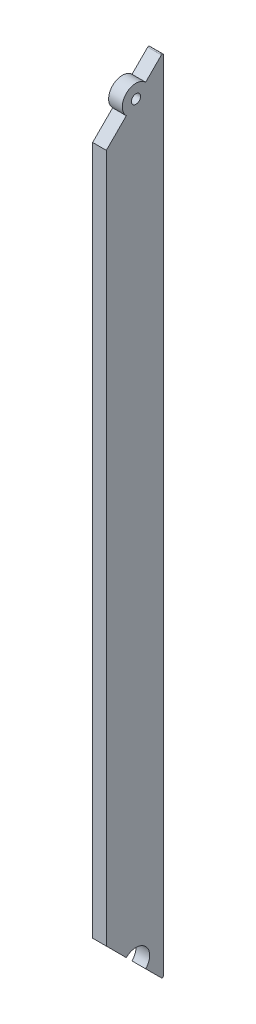
ISO-10303-21;
HEADER;
FILE_DESCRIPTION(('STEP AP214'),'2;1');
FILE_NAME('part.step','',(''),(''),'','','');
FILE_SCHEMA(('AUTOMOTIVE_DESIGN { 1 0 10303 214 1 1 1 1 }'));
ENDSEC;
DATA;
#1=APPLICATION_CONTEXT('core data for automotive mechanical design processes');
#2=APPLICATION_PROTOCOL_DEFINITION('international standard','automotive_design',2000,#1);
#3=PRODUCT_CONTEXT('',#1,'mechanical');
#4=PRODUCT('Part','Part','',(#3));
#5=PRODUCT_RELATED_PRODUCT_CATEGORY('part','',(#4));
#6=PRODUCT_DEFINITION_FORMATION('','',#4);
#7=PRODUCT_DEFINITION_CONTEXT('part definition',#1,'design');
#8=PRODUCT_DEFINITION('design','',#6,#7);
#9=PRODUCT_DEFINITION_SHAPE('','',#8);
#10=(LENGTH_UNIT() NAMED_UNIT(*) SI_UNIT(.MILLI.,.METRE.));
#11=(NAMED_UNIT(*) PLANE_ANGLE_UNIT() SI_UNIT($,.RADIAN.));
#12=(NAMED_UNIT(*) SI_UNIT($,.STERADIAN.) SOLID_ANGLE_UNIT());
#13=UNCERTAINTY_MEASURE_WITH_UNIT(LENGTH_MEASURE(1.E-05),#10,'distance_accuracy_value','');
#14=(GEOMETRIC_REPRESENTATION_CONTEXT(3) GLOBAL_UNCERTAINTY_ASSIGNED_CONTEXT((#13)) GLOBAL_UNIT_ASSIGNED_CONTEXT((#10,
#11,#12)) REPRESENTATION_CONTEXT('',''));
#15=CARTESIAN_POINT('',(0.,0.,0.));
#16=DIRECTION('',(0.,0.,1.));
#17=DIRECTION('',(1.,0.,0.));
#18=AXIS2_PLACEMENT_3D('',#15,#16,#17);
#19=CARTESIAN_POINT('',(6.,24.9999999999999,25.));
#20=DIRECTION('',(0.,0.707106781186549,-0.707106781186546));
#21=DIRECTION('',(0.,0.707106781186546,0.707106781186549));
#22=AXIS2_PLACEMENT_3D('',#19,#20,#21);
#23=PLANE('',#22);
#24=DIRECTION('',(0.,-0.707106781186546,-0.707106781186549));
#25=VECTOR('',#24,1.);
#26=CARTESIAN_POINT('',(0.,24.9999999999999,25.));
#27=LINE('',#26,#25);
#28=CARTESIAN_POINT('',(0.,24.9999999999999,25.));
#29=VERTEX_POINT('',#28);
#30=CARTESIAN_POINT('',(0.,16.2426406871193,16.2426406871193));
#31=VERTEX_POINT('',#30);
#32=EDGE_CURVE('E131',#29,#31,#27,.T.);
#33=ORIENTED_EDGE('',*,*,#32,.T.);
#34=DIRECTION('',(1.,0.,0.));
#35=VECTOR('',#34,1.);
#36=CARTESIAN_POINT('',(0.,16.2426406871193,16.2426406871193));
#37=LINE('',#36,#35);
#38=CARTESIAN_POINT('',(6.,16.2426406871193,16.2426406871193));
#39=VERTEX_POINT('',#38);
#40=EDGE_CURVE('E53',#31,#39,#37,.T.);
#41=ORIENTED_EDGE('',*,*,#40,.T.);
#42=DIRECTION('',(0.,-0.707106781186546,-0.707106781186549));
#43=VECTOR('',#42,1.);
#44=CARTESIAN_POINT('',(6.,24.9999999999999,25.));
#45=LINE('',#44,#43);
#46=CARTESIAN_POINT('',(6.,24.9999999999999,25.));
#47=VERTEX_POINT('',#46);
#48=EDGE_CURVE('E193',#47,#39,#45,.T.);
#49=ORIENTED_EDGE('',*,*,#48,.F.);
#50=DIRECTION('',(-1.,0.,0.));
#51=VECTOR('',#50,1.);
#52=CARTESIAN_POINT('',(6.,24.9999999999999,25.));
#53=LINE('',#52,#51);
#54=EDGE_CURVE('E152',#47,#29,#53,.T.);
#55=ORIENTED_EDGE('',*,*,#54,.T.);
#56=EDGE_LOOP('',(#33,#41,#49,#55));
#57=FACE_BOUND('',#56,.T.);
#58=ADVANCED_FACE('F39',(#57),#23,.F.);
#59=CARTESIAN_POINT('',(6.,327.,25.));
#60=DIRECTION('',(0.,-0.707106781186544,-0.707106781186551));
#61=DIRECTION('',(0.,0.707106781186551,-0.707106781186544));
#62=AXIS2_PLACEMENT_3D('',#59,#60,#61);
#63=PLANE('',#62);
#64=DIRECTION('',(0.,-0.707106781186552,0.707106781186544));
#65=VECTOR('',#64,1.);
#66=CARTESIAN_POINT('',(0.,327.,25.));
#67=LINE('',#66,#65);
#68=CARTESIAN_POINT('',(0.,351.146446609407,0.853553390593276));
#69=VERTEX_POINT('',#68);
#70=CARTESIAN_POINT('',(0.,344.242640687119,7.75735931288067));
#71=VERTEX_POINT('',#70);
#72=EDGE_CURVE('E150',#69,#71,#67,.T.);
#73=ORIENTED_EDGE('',*,*,#72,.T.);
#74=DIRECTION('',(1.,0.,0.));
#75=VECTOR('',#74,1.);
#76=CARTESIAN_POINT('',(-16.9705627484772,344.242640687119,7.75735931288067));
#77=LINE('',#76,#75);
#78=CARTESIAN_POINT('',(6.,344.242640687119,7.75735931288067));
#79=VERTEX_POINT('',#78);
#80=EDGE_CURVE('E133',#71,#79,#77,.T.);
#81=ORIENTED_EDGE('',*,*,#80,.T.);
#82=DIRECTION('',(0.,-0.707106781186552,0.707106781186544));
#83=VECTOR('',#82,1.);
#84=CARTESIAN_POINT('',(6.,327.,25.));
#85=LINE('',#84,#83);
#86=CARTESIAN_POINT('',(6.,351.146446609407,0.853553390593276));
#87=VERTEX_POINT('',#86);
#88=EDGE_CURVE('E179',#87,#79,#85,.T.);
#89=ORIENTED_EDGE('',*,*,#88,.F.);
#90=DIRECTION('',(-1.,0.,0.));
#91=VECTOR('',#90,1.);
#92=CARTESIAN_POINT('',(6.,351.146446609407,0.853553390593283));
#93=LINE('',#92,#91);
#94=EDGE_CURVE('E50',#87,#69,#93,.T.);
#95=ORIENTED_EDGE('',*,*,#94,.T.);
#96=EDGE_LOOP('',(#73,#81,#89,#95));
#97=FACE_BOUND('',#96,.T.);
#98=ADVANCED_FACE('F173',(#97),#63,.F.);
#99=CARTESIAN_POINT('',(6.,7.7573593128807,7.75735931288073));
#100=VERTEX_POINT('',#99);
#101=CARTESIAN_POINT('',(6.,0.853553390593287,0.85355339059329));
#102=VERTEX_POINT('',#101);
#103=EDGE_CURVE('E130',#100,#102,#45,.T.);
#104=ORIENTED_EDGE('',*,*,#103,.F.);
#105=DIRECTION('',(1.,0.,0.));
#106=VECTOR('',#105,1.);
#107=CARTESIAN_POINT('',(0.,7.7573593128807,7.75735931288073));
#108=LINE('',#107,#106);
#109=CARTESIAN_POINT('',(0.,7.7573593128807,7.75735931288073));
#110=VERTEX_POINT('',#109);
#111=EDGE_CURVE('E112',#100,#110,#108,.F.);
#112=ORIENTED_EDGE('',*,*,#111,.T.);
#113=CARTESIAN_POINT('',(0.,0.853553390593287,0.85355339059329));
#114=VERTEX_POINT('',#113);
#115=EDGE_CURVE('E124',#110,#114,#27,.T.);
#116=ORIENTED_EDGE('',*,*,#115,.T.);
#117=DIRECTION('',(-1.,0.,0.));
#118=VECTOR('',#117,1.);
#119=CARTESIAN_POINT('',(6.,0.853553390593287,0.85355339059329));
#120=LINE('',#119,#118);
#121=EDGE_CURVE('E162',#114,#102,#120,.F.);
#122=ORIENTED_EDGE('',*,*,#121,.T.);
#123=EDGE_LOOP('',(#104,#112,#116,#122));
#124=FACE_BOUND('',#123,.T.);
#125=ADVANCED_FACE('F123',(#124),#23,.F.);
#126=CARTESIAN_POINT('',(6.,352.,0.));
#127=DIRECTION('',(0.,0.,1.));
#128=DIRECTION('',(1.,0.,0.));
#129=AXIS2_PLACEMENT_3D('',#126,#127,#128);
#130=PLANE('',#129);
#131=DIRECTION('',(0.,1.,0.));
#132=VECTOR('',#131,1.);
#133=CARTESIAN_POINT('',(6.,352.,0.));
#134=LINE('',#133,#132);
#135=CARTESIAN_POINT('',(6.,1.20710678118657,0.));
#136=VERTEX_POINT('',#135);
#137=CARTESIAN_POINT('',(6.,350.792893218813,0.));
#138=VERTEX_POINT('',#137);
#139=EDGE_CURVE('E196',#136,#138,#134,.T.);
#140=ORIENTED_EDGE('',*,*,#139,.F.);
#141=DIRECTION('',(-1.,0.,0.));
#142=VECTOR('',#141,1.);
#143=CARTESIAN_POINT('',(6.,1.20710678118657,0.));
#144=LINE('',#143,#142);
#145=CARTESIAN_POINT('',(0.,1.20710678118657,0.));
#146=VERTEX_POINT('',#145);
#147=EDGE_CURVE('E159',#136,#146,#144,.T.);
#148=ORIENTED_EDGE('',*,*,#147,.T.);
#149=DIRECTION('',(0.,1.,0.));
#150=VECTOR('',#149,1.);
#151=CARTESIAN_POINT('',(0.,352.,0.));
#152=LINE('',#151,#150);
#153=CARTESIAN_POINT('',(0.,350.792893218813,0.));
#154=VERTEX_POINT('',#153);
#155=EDGE_CURVE('E136',#146,#154,#152,.T.);
#156=ORIENTED_EDGE('',*,*,#155,.T.);
#157=DIRECTION('',(-1.,0.,0.));
#158=VECTOR('',#157,1.);
#159=CARTESIAN_POINT('',(6.,350.792893218813,0.));
#160=LINE('',#159,#158);
#161=EDGE_CURVE('E160',#154,#138,#160,.F.);
#162=ORIENTED_EDGE('',*,*,#161,.T.);
#163=EDGE_LOOP('',(#140,#148,#156,#162));
#164=FACE_BOUND('',#163,.T.);
#165=ADVANCED_FACE('F245',(#164),#130,.F.);
#166=CARTESIAN_POINT('',(6.,335.757359312881,16.2426406871192));
#167=VERTEX_POINT('',#166);
#168=CARTESIAN_POINT('',(6.,327.,25.));
#169=VERTEX_POINT('',#168);
#170=EDGE_CURVE('E64',#167,#169,#85,.T.);
#171=ORIENTED_EDGE('',*,*,#170,.F.);
#172=DIRECTION('',(1.,0.,0.));
#173=VECTOR('',#172,1.);
#174=CARTESIAN_POINT('',(-16.9705627484772,335.757359312881,16.2426406871192));
#175=LINE('',#174,#173);
#176=CARTESIAN_POINT('',(0.,335.757359312881,16.2426406871192));
#177=VERTEX_POINT('',#176);
#178=EDGE_CURVE('E140',#167,#177,#175,.F.);
#179=ORIENTED_EDGE('',*,*,#178,.T.);
#180=CARTESIAN_POINT('',(0.,327.,25.));
#181=VERTEX_POINT('',#180);
#182=EDGE_CURVE('E147',#177,#181,#67,.T.);
#183=ORIENTED_EDGE('',*,*,#182,.T.);
#184=DIRECTION('',(-1.,0.,0.));
#185=VECTOR('',#184,1.);
#186=CARTESIAN_POINT('',(6.,327.,25.));
#187=LINE('',#186,#185);
#188=EDGE_CURVE('E151',#169,#181,#187,.T.);
#189=ORIENTED_EDGE('',*,*,#188,.F.);
#190=EDGE_LOOP('',(#171,#179,#183,#189));
#191=FACE_BOUND('',#190,.T.);
#192=ADVANCED_FACE('F202',(#191),#63,.F.);
#193=CARTESIAN_POINT('',(6.,24.9999999999999,25.));
#194=DIRECTION('',(0.,0.,-1.));
#195=DIRECTION('',(0.,1.,0.));
#196=AXIS2_PLACEMENT_3D('',#193,#194,#195);
#197=PLANE('',#196);
#198=DIRECTION('',(0.,-1.,0.));
#199=VECTOR('',#198,1.);
#200=CARTESIAN_POINT('',(0.,24.9999999999999,25.));
#201=LINE('',#200,#199);
#202=EDGE_CURVE('E146',#181,#29,#201,.T.);
#203=ORIENTED_EDGE('',*,*,#202,.T.);
#204=ORIENTED_EDGE('',*,*,#54,.F.);
#205=DIRECTION('',(0.,-1.,0.));
#206=VECTOR('',#205,1.);
#207=CARTESIAN_POINT('',(6.,24.9999999999999,25.));
#208=LINE('',#207,#206);
#209=EDGE_CURVE('E144',#169,#47,#208,.T.);
#210=ORIENTED_EDGE('',*,*,#209,.F.);
#211=ORIENTED_EDGE('',*,*,#188,.T.);
#212=EDGE_LOOP('',(#203,#204,#210,#211));
#213=FACE_BOUND('',#212,.T.);
#214=ADVANCED_FACE('F204',(#213),#197,.F.);
#215=CARTESIAN_POINT('',(6.,0.,0.));
#216=DIRECTION('',(1.,0.,0.));
#217=DIRECTION('',(0.,0.,-1.));
#218=AXIS2_PLACEMENT_3D('',#215,#216,#217);
#219=PLANE('',#218);
#220=CARTESIAN_POINT('',(6.,340.,11.9999999999998));
#221=DIRECTION('',(1.,0.,0.));
#222=DIRECTION('',(0.,0.,-1.));
#223=AXIS2_PLACEMENT_3D('',#220,#221,#222);
#224=CIRCLE('',#223,2.);
#225=CARTESIAN_POINT('',(6.,340.,9.99999999999978));
#226=VERTEX_POINT('',#225);
#227=EDGE_CURVE('E206',#226,#226,#224,.T.);
#228=ORIENTED_EDGE('',*,*,#227,.F.);
#229=EDGE_LOOP('',(#228));
#230=FACE_BOUND('',#229,.T.);
#231=CARTESIAN_POINT('',(6.,12.,12.));
#232=DIRECTION('',(1.,0.,0.));
#233=DIRECTION('',(0.,0.,-1.));
#234=AXIS2_PLACEMENT_3D('',#231,#232,#233);
#235=CIRCLE('',#234,6.);
#236=EDGE_CURVE('E209',#100,#39,#235,.T.);
#237=ORIENTED_EDGE('',*,*,#236,.F.);
#238=ORIENTED_EDGE('',*,*,#103,.T.);
#239=CARTESIAN_POINT('',(6.,1.20710678118657,0.5));
#240=DIRECTION('',(1.,0.,0.));
#241=DIRECTION('',(0.,0.,-1.));
#242=AXIS2_PLACEMENT_3D('',#239,#240,#241);
#243=CIRCLE('',#242,0.5);
#244=EDGE_CURVE('E166',#102,#136,#243,.T.);
#245=ORIENTED_EDGE('',*,*,#244,.T.);
#246=ORIENTED_EDGE('',*,*,#139,.T.);
#247=CARTESIAN_POINT('',(6.,350.792893218813,0.5));
#248=DIRECTION('',(1.,0.,0.));
#249=DIRECTION('',(0.,0.,-1.));
#250=AXIS2_PLACEMENT_3D('',#247,#248,#249);
#251=CIRCLE('',#250,0.5);
#252=EDGE_CURVE('E169',#138,#87,#251,.T.);
#253=ORIENTED_EDGE('',*,*,#252,.T.);
#254=ORIENTED_EDGE('',*,*,#88,.T.);
#255=CARTESIAN_POINT('',(6.,340.,11.9999999999998));
#256=DIRECTION('',(1.,0.,0.));
#257=DIRECTION('',(0.,0.,-1.));
#258=AXIS2_PLACEMENT_3D('',#255,#256,#257);
#259=CIRCLE('',#258,6.00000000000001);
#260=EDGE_CURVE('E188',#79,#167,#259,.T.);
#261=ORIENTED_EDGE('',*,*,#260,.T.);
#262=ORIENTED_EDGE('',*,*,#170,.T.);
#263=ORIENTED_EDGE('',*,*,#209,.T.);
#264=ORIENTED_EDGE('',*,*,#48,.T.);
#265=EDGE_LOOP('',(#237,#238,#245,#246,#253,#254,#261,#262,#263,#264));
#266=FACE_BOUND('',#265,.T.);
#267=ADVANCED_FACE('F199',(#230,#266),#219,.T.);
#268=CARTESIAN_POINT('',(0.,0.,0.));
#269=DIRECTION('',(1.,0.,0.));
#270=DIRECTION('',(0.,0.,-1.));
#271=AXIS2_PLACEMENT_3D('',#268,#269,#270);
#272=PLANE('',#271);
#273=CARTESIAN_POINT('',(0.,340.,11.9999999999998));
#274=DIRECTION('',(1.,0.,0.));
#275=DIRECTION('',(0.,0.,-1.));
#276=AXIS2_PLACEMENT_3D('',#273,#274,#275);
#277=CIRCLE('',#276,2.);
#278=CARTESIAN_POINT('',(0.,340.,9.99999999999978));
#279=VERTEX_POINT('',#278);
#280=EDGE_CURVE('E127',#279,#279,#277,.T.);
#281=ORIENTED_EDGE('',*,*,#280,.T.);
#282=EDGE_LOOP('',(#281));
#283=FACE_BOUND('',#282,.T.);
#284=ORIENTED_EDGE('',*,*,#115,.F.);
#285=CARTESIAN_POINT('',(0.,12.,12.));
#286=DIRECTION('',(1.,0.,0.));
#287=DIRECTION('',(0.,0.,-1.));
#288=AXIS2_PLACEMENT_3D('',#285,#286,#287);
#289=CIRCLE('',#288,6.);
#290=EDGE_CURVE('E11',#110,#31,#289,.T.);
#291=ORIENTED_EDGE('',*,*,#290,.T.);
#292=ORIENTED_EDGE('',*,*,#32,.F.);
#293=ORIENTED_EDGE('',*,*,#202,.F.);
#294=ORIENTED_EDGE('',*,*,#182,.F.);
#295=CARTESIAN_POINT('',(0.,340.,11.9999999999998));
#296=DIRECTION('',(1.,0.,0.));
#297=DIRECTION('',(0.,0.,-1.));
#298=AXIS2_PLACEMENT_3D('',#295,#296,#297);
#299=CIRCLE('',#298,6.00000000000001);
#300=EDGE_CURVE('E181',#177,#71,#299,.F.);
#301=ORIENTED_EDGE('',*,*,#300,.T.);
#302=ORIENTED_EDGE('',*,*,#72,.F.);
#303=CARTESIAN_POINT('',(0.,350.792893218813,0.5));
#304=DIRECTION('',(1.,0.,0.));
#305=DIRECTION('',(0.,0.,-1.));
#306=AXIS2_PLACEMENT_3D('',#303,#304,#305);
#307=CIRCLE('',#306,0.5);
#308=EDGE_CURVE('E161',#69,#154,#307,.F.);
#309=ORIENTED_EDGE('',*,*,#308,.T.);
#310=ORIENTED_EDGE('',*,*,#155,.F.);
#311=CARTESIAN_POINT('',(0.,1.20710678118657,0.5));
#312=DIRECTION('',(1.,0.,0.));
#313=DIRECTION('',(0.,0.,-1.));
#314=AXIS2_PLACEMENT_3D('',#311,#312,#313);
#315=CIRCLE('',#314,0.5);
#316=EDGE_CURVE('E135',#146,#114,#315,.F.);
#317=ORIENTED_EDGE('',*,*,#316,.T.);
#318=EDGE_LOOP('',(#284,#291,#292,#293,#294,#301,#302,#309,#310,#317));
#319=FACE_BOUND('',#318,.T.);
#320=ADVANCED_FACE('F129',(#283,#319),#272,.F.);
#321=CARTESIAN_POINT('',(6.,1.20710678118657,0.5));
#322=DIRECTION('',(-1.,0.,0.));
#323=DIRECTION('',(0.,0.,1.));
#324=AXIS2_PLACEMENT_3D('',#321,#322,#323);
#325=CYLINDRICAL_SURFACE('',#324,0.5);
#326=ORIENTED_EDGE('',*,*,#244,.F.);
#327=ORIENTED_EDGE('',*,*,#121,.F.);
#328=ORIENTED_EDGE('',*,*,#316,.F.);
#329=ORIENTED_EDGE('',*,*,#147,.F.);
#330=EDGE_LOOP('',(#326,#327,#328,#329));
#331=FACE_BOUND('',#330,.T.);
#332=ADVANCED_FACE('F228',(#331),#325,.T.);
#333=CARTESIAN_POINT('',(6.,350.792893218813,0.5));
#334=DIRECTION('',(-1.,0.,0.));
#335=DIRECTION('',(0.,0.,1.));
#336=AXIS2_PLACEMENT_3D('',#333,#334,#335);
#337=CYLINDRICAL_SURFACE('',#336,0.5);
#338=ORIENTED_EDGE('',*,*,#252,.F.);
#339=ORIENTED_EDGE('',*,*,#161,.F.);
#340=ORIENTED_EDGE('',*,*,#308,.F.);
#341=ORIENTED_EDGE('',*,*,#94,.F.);
#342=EDGE_LOOP('',(#338,#339,#340,#341));
#343=FACE_BOUND('',#342,.T.);
#344=ADVANCED_FACE('F41',(#343),#337,.T.);
#345=CARTESIAN_POINT('',(-16.9705627484772,340.,11.9999999999998));
#346=DIRECTION('',(1.,0.,0.));
#347=DIRECTION('',(0.,0.,-1.));
#348=AXIS2_PLACEMENT_3D('',#345,#346,#347);
#349=CYLINDRICAL_SURFACE('',#348,6.00000000000001);
#350=ORIENTED_EDGE('',*,*,#80,.F.);
#351=ORIENTED_EDGE('',*,*,#300,.F.);
#352=ORIENTED_EDGE('',*,*,#178,.F.);
#353=ORIENTED_EDGE('',*,*,#260,.F.);
#354=EDGE_LOOP('',(#350,#351,#352,#353));
#355=FACE_BOUND('',#354,.T.);
#356=ADVANCED_FACE('F259',(#355),#349,.T.);
#357=CARTESIAN_POINT('',(0.,12.,12.));
#358=DIRECTION('',(1.,0.,0.));
#359=DIRECTION('',(0.,0.,-1.));
#360=AXIS2_PLACEMENT_3D('',#357,#358,#359);
#361=CYLINDRICAL_SURFACE('',#360,6.);
#362=ORIENTED_EDGE('',*,*,#290,.F.);
#363=ORIENTED_EDGE('',*,*,#111,.F.);
#364=ORIENTED_EDGE('',*,*,#236,.T.);
#365=ORIENTED_EDGE('',*,*,#40,.F.);
#366=EDGE_LOOP('',(#362,#363,#364,#365));
#367=FACE_BOUND('',#366,.T.);
#368=ADVANCED_FACE('F114',(#367),#361,.F.);
#369=CARTESIAN_POINT('',(0.,340.,11.9999999999998));
#370=DIRECTION('',(1.,0.,0.));
#371=DIRECTION('',(0.,0.,-1.));
#372=AXIS2_PLACEMENT_3D('',#369,#370,#371);
#373=CYLINDRICAL_SURFACE('',#372,2.);
#374=ORIENTED_EDGE('',*,*,#280,.F.);
#375=EDGE_LOOP('',(#374));
#376=FACE_BOUND('',#375,.T.);
#377=ORIENTED_EDGE('',*,*,#227,.T.);
#378=EDGE_LOOP('',(#377));
#379=FACE_BOUND('',#378,.T.);
#380=ADVANCED_FACE('F220',(#376,#379),#373,.F.);
#381=CLOSED_SHELL('',(#58,#98,#125,#165,#192,#214,#267,#320,#332,#344,#356,#368,#380));
#382=MANIFOLD_SOLID_BREP('B2',#381);
#383=ADVANCED_BREP_SHAPE_REPRESENTATION('',(#18,#382),#14);
#384=SHAPE_DEFINITION_REPRESENTATION(#9,#383);
ENDSEC;
END-ISO-10303-21;
